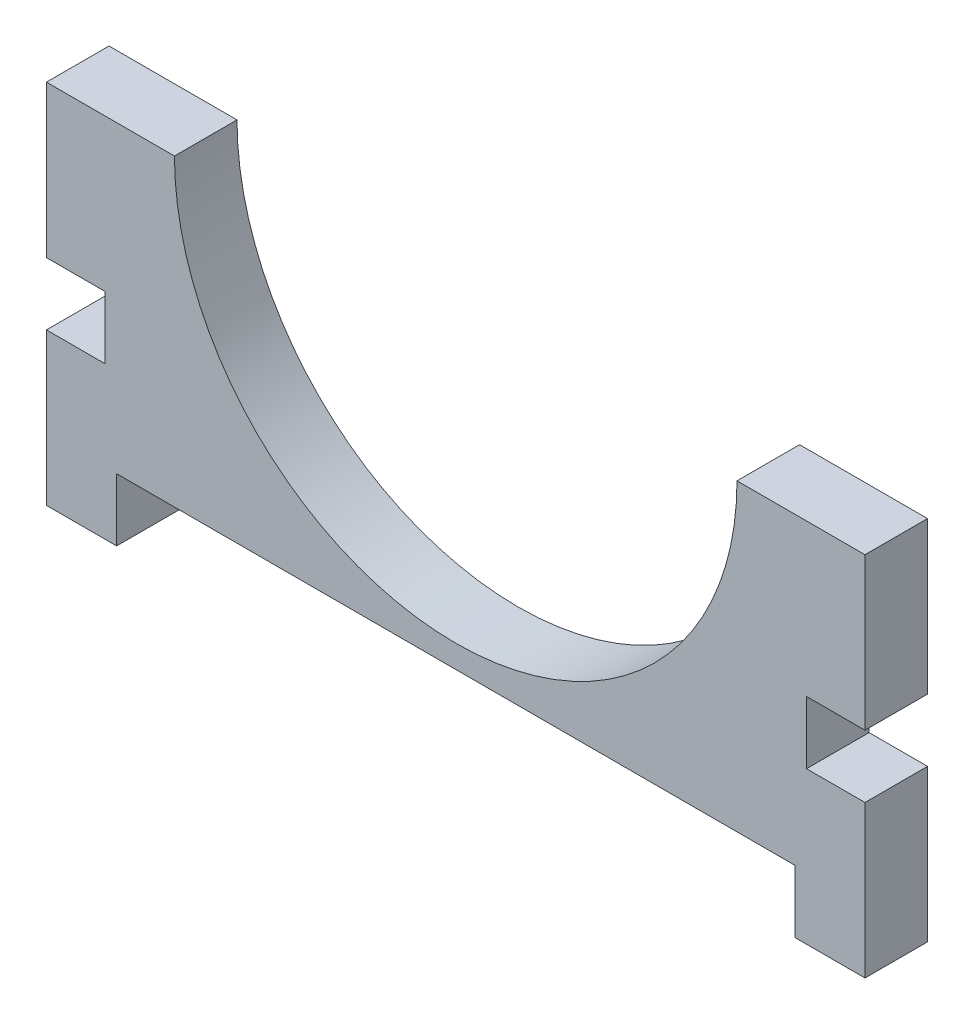
ISO-10303-21;
HEADER;
FILE_DESCRIPTION(('STEP AP214'),'2;1');
FILE_NAME('part.step','',(''),(''),'','','');
FILE_SCHEMA(('AUTOMOTIVE_DESIGN { 1 0 10303 214 1 1 1 1 }'));
ENDSEC;
DATA;
#1=APPLICATION_CONTEXT('core data for automotive mechanical design processes');
#2=APPLICATION_PROTOCOL_DEFINITION('international standard','automotive_design',2000,#1);
#3=PRODUCT_CONTEXT('',#1,'mechanical');
#4=PRODUCT('Part','Part','',(#3));
#5=PRODUCT_RELATED_PRODUCT_CATEGORY('part','',(#4));
#6=PRODUCT_DEFINITION_FORMATION('','',#4);
#7=PRODUCT_DEFINITION_CONTEXT('part definition',#1,'design');
#8=PRODUCT_DEFINITION('design','',#6,#7);
#9=PRODUCT_DEFINITION_SHAPE('','',#8);
#10=(LENGTH_UNIT() NAMED_UNIT(*) SI_UNIT(.MILLI.,.METRE.));
#11=(NAMED_UNIT(*) PLANE_ANGLE_UNIT() SI_UNIT($,.RADIAN.));
#12=(NAMED_UNIT(*) SI_UNIT($,.STERADIAN.) SOLID_ANGLE_UNIT());
#13=UNCERTAINTY_MEASURE_WITH_UNIT(LENGTH_MEASURE(1.E-05),#10,'distance_accuracy_value','');
#14=(GEOMETRIC_REPRESENTATION_CONTEXT(3) GLOBAL_UNCERTAINTY_ASSIGNED_CONTEXT((#13)) GLOBAL_UNIT_ASSIGNED_CONTEXT((#10,
#11,#12)) REPRESENTATION_CONTEXT('',''));
#15=CARTESIAN_POINT('',(0.,0.,0.));
#16=DIRECTION('',(0.,0.,1.));
#17=DIRECTION('',(1.,0.,0.));
#18=AXIS2_PLACEMENT_3D('',#15,#16,#17);
#19=CARTESIAN_POINT('',(35.,31.35,5.35));
#20=DIRECTION('',(0.,0.,-1.));
#21=DIRECTION('',(-1.,0.,0.));
#22=AXIS2_PLACEMENT_3D('',#19,#20,#21);
#23=CYLINDRICAL_SURFACE('',#22,24.055);
#24=CARTESIAN_POINT('',(35.,31.35,0.));
#25=DIRECTION('',(0.,0.,-1.));
#26=DIRECTION('',(1.,0.,0.));
#27=AXIS2_PLACEMENT_3D('',#24,#25,#26);
#28=CIRCLE('',#27,24.055);
#29=CARTESIAN_POINT('',(59.055,31.35,0.));
#30=VERTEX_POINT('',#29);
#31=CARTESIAN_POINT('',(10.945,31.35,0.));
#32=VERTEX_POINT('',#31);
#33=EDGE_CURVE('E189',#30,#32,#28,.T.);
#34=ORIENTED_EDGE('',*,*,#33,.T.);
#35=DIRECTION('',(0.,0.,-1.));
#36=VECTOR('',#35,1.);
#37=CARTESIAN_POINT('',(10.945,31.35,5.35));
#38=LINE('',#37,#36);
#39=CARTESIAN_POINT('',(10.945,31.35,5.35));
#40=VERTEX_POINT('',#39);
#41=EDGE_CURVE('E11',#40,#32,#38,.T.);
#42=ORIENTED_EDGE('',*,*,#41,.F.);
#43=CARTESIAN_POINT('',(35.,31.35,5.35));
#44=DIRECTION('',(0.,0.,-1.));
#45=DIRECTION('',(1.,0.,0.));
#46=AXIS2_PLACEMENT_3D('',#43,#44,#45);
#47=CIRCLE('',#46,24.055);
#48=CARTESIAN_POINT('',(59.055,31.35,5.35));
#49=VERTEX_POINT('',#48);
#50=EDGE_CURVE('E223',#49,#40,#47,.T.);
#51=ORIENTED_EDGE('',*,*,#50,.F.);
#52=DIRECTION('',(0.,0.,-1.));
#53=VECTOR('',#52,1.);
#54=CARTESIAN_POINT('',(59.055,31.35,5.35));
#55=LINE('',#54,#53);
#56=EDGE_CURVE('E185',#49,#30,#55,.T.);
#57=ORIENTED_EDGE('',*,*,#56,.T.);
#58=EDGE_LOOP('',(#34,#42,#51,#57));
#59=FACE_BOUND('',#58,.T.);
#60=ADVANCED_FACE('F33',(#59),#23,.F.);
#61=CARTESIAN_POINT('',(10.945,31.35,5.35));
#62=DIRECTION('',(0.,-1.,0.));
#63=DIRECTION('',(0.,0.,-1.));
#64=AXIS2_PLACEMENT_3D('',#61,#62,#63);
#65=PLANE('',#64);
#66=DIRECTION('',(-1.,0.,0.));
#67=VECTOR('',#66,1.);
#68=CARTESIAN_POINT('',(10.945,31.35,0.));
#69=LINE('',#68,#67);
#70=CARTESIAN_POINT('',(0.,31.35,0.));
#71=VERTEX_POINT('',#70);
#72=EDGE_CURVE('E192',#32,#71,#69,.T.);
#73=ORIENTED_EDGE('',*,*,#72,.T.);
#74=DIRECTION('',(0.,0.,-1.));
#75=VECTOR('',#74,1.);
#76=CARTESIAN_POINT('',(0.,31.35,5.35));
#77=LINE('',#76,#75);
#78=CARTESIAN_POINT('',(0.,31.35,5.35));
#79=VERTEX_POINT('',#78);
#80=EDGE_CURVE('E41',#79,#71,#77,.T.);
#81=ORIENTED_EDGE('',*,*,#80,.F.);
#82=DIRECTION('',(-1.,0.,0.));
#83=VECTOR('',#82,1.);
#84=CARTESIAN_POINT('',(10.945,31.35,5.35));
#85=LINE('',#84,#83);
#86=EDGE_CURVE('E122',#40,#79,#85,.T.);
#87=ORIENTED_EDGE('',*,*,#86,.F.);
#88=ORIENTED_EDGE('',*,*,#41,.T.);
#89=EDGE_LOOP('',(#73,#81,#87,#88));
#90=FACE_BOUND('',#89,.T.);
#91=ADVANCED_FACE('F331',(#90),#65,.F.);
#92=CARTESIAN_POINT('',(0.,31.35,5.35));
#93=DIRECTION('',(1.,0.,0.));
#94=DIRECTION('',(0.,0.,-1.));
#95=AXIS2_PLACEMENT_3D('',#92,#93,#94);
#96=PLANE('',#95);
#97=DIRECTION('',(0.,-1.,0.));
#98=VECTOR('',#97,1.);
#99=CARTESIAN_POINT('',(0.,31.35,0.));
#100=LINE('',#99,#98);
#101=CARTESIAN_POINT('',(0.,18.35,0.));
#102=VERTEX_POINT('',#101);
#103=EDGE_CURVE('E194',#71,#102,#100,.T.);
#104=ORIENTED_EDGE('',*,*,#103,.T.);
#105=DIRECTION('',(0.,0.,-1.));
#106=VECTOR('',#105,1.);
#107=CARTESIAN_POINT('',(0.,18.35,5.35));
#108=LINE('',#107,#106);
#109=CARTESIAN_POINT('',(0.,18.35,5.35));
#110=VERTEX_POINT('',#109);
#111=EDGE_CURVE('E260',#110,#102,#108,.T.);
#112=ORIENTED_EDGE('',*,*,#111,.F.);
#113=DIRECTION('',(0.,-1.,0.));
#114=VECTOR('',#113,1.);
#115=CARTESIAN_POINT('',(0.,31.35,5.35));
#116=LINE('',#115,#114);
#117=EDGE_CURVE('E268',#79,#110,#116,.T.);
#118=ORIENTED_EDGE('',*,*,#117,.F.);
#119=ORIENTED_EDGE('',*,*,#80,.T.);
#120=EDGE_LOOP('',(#104,#112,#118,#119));
#121=FACE_BOUND('',#120,.T.);
#122=ADVANCED_FACE('F266',(#121),#96,.F.);
#123=CARTESIAN_POINT('',(0.,18.35,5.35));
#124=DIRECTION('',(0.,1.,0.));
#125=DIRECTION('',(0.,0.,1.));
#126=AXIS2_PLACEMENT_3D('',#123,#124,#125);
#127=PLANE('',#126);
#128=DIRECTION('',(1.,0.,0.));
#129=VECTOR('',#128,1.);
#130=CARTESIAN_POINT('',(0.,18.35,0.));
#131=LINE('',#130,#129);
#132=CARTESIAN_POINT('',(5.,18.35,0.));
#133=VERTEX_POINT('',#132);
#134=EDGE_CURVE('E196',#102,#133,#131,.T.);
#135=ORIENTED_EDGE('',*,*,#134,.T.);
#136=DIRECTION('',(0.,0.,-1.));
#137=VECTOR('',#136,1.);
#138=CARTESIAN_POINT('',(5.,18.35,5.35));
#139=LINE('',#138,#137);
#140=CARTESIAN_POINT('',(5.,18.35,5.35));
#141=VERTEX_POINT('',#140);
#142=EDGE_CURVE('E257',#141,#133,#139,.T.);
#143=ORIENTED_EDGE('',*,*,#142,.F.);
#144=DIRECTION('',(1.,0.,0.));
#145=VECTOR('',#144,1.);
#146=CARTESIAN_POINT('',(0.,18.35,5.35));
#147=LINE('',#146,#145);
#148=EDGE_CURVE('E286',#110,#141,#147,.T.);
#149=ORIENTED_EDGE('',*,*,#148,.F.);
#150=ORIENTED_EDGE('',*,*,#111,.T.);
#151=EDGE_LOOP('',(#135,#143,#149,#150));
#152=FACE_BOUND('',#151,.T.);
#153=ADVANCED_FACE('F277',(#152),#127,.F.);
#154=CARTESIAN_POINT('',(5.,18.35,5.35));
#155=DIRECTION('',(1.,0.,0.));
#156=DIRECTION('',(0.,0.,-1.));
#157=AXIS2_PLACEMENT_3D('',#154,#155,#156);
#158=PLANE('',#157);
#159=DIRECTION('',(0.,-1.,0.));
#160=VECTOR('',#159,1.);
#161=CARTESIAN_POINT('',(5.,18.35,0.));
#162=LINE('',#161,#160);
#163=CARTESIAN_POINT('',(5.,13.,0.));
#164=VERTEX_POINT('',#163);
#165=EDGE_CURVE('E198',#133,#164,#162,.T.);
#166=ORIENTED_EDGE('',*,*,#165,.T.);
#167=DIRECTION('',(0.,0.,-1.));
#168=VECTOR('',#167,1.);
#169=CARTESIAN_POINT('',(5.,13.,5.35));
#170=LINE('',#169,#168);
#171=CARTESIAN_POINT('',(5.,13.,5.35));
#172=VERTEX_POINT('',#171);
#173=EDGE_CURVE('E254',#172,#164,#170,.T.);
#174=ORIENTED_EDGE('',*,*,#173,.F.);
#175=DIRECTION('',(0.,-1.,0.));
#176=VECTOR('',#175,1.);
#177=CARTESIAN_POINT('',(5.,18.35,5.35));
#178=LINE('',#177,#176);
#179=EDGE_CURVE('E283',#141,#172,#178,.T.);
#180=ORIENTED_EDGE('',*,*,#179,.F.);
#181=ORIENTED_EDGE('',*,*,#142,.T.);
#182=EDGE_LOOP('',(#166,#174,#180,#181));
#183=FACE_BOUND('',#182,.T.);
#184=ADVANCED_FACE('F281',(#183),#158,.F.);
#185=CARTESIAN_POINT('',(5.,13.,5.35));
#186=DIRECTION('',(0.,-1.,0.));
#187=DIRECTION('',(0.,0.,-1.));
#188=AXIS2_PLACEMENT_3D('',#185,#186,#187);
#189=PLANE('',#188);
#190=DIRECTION('',(-1.,0.,0.));
#191=VECTOR('',#190,1.);
#192=CARTESIAN_POINT('',(5.,13.,0.));
#193=LINE('',#192,#191);
#194=CARTESIAN_POINT('',(0.,13.,0.));
#195=VERTEX_POINT('',#194);
#196=EDGE_CURVE('E200',#164,#195,#193,.T.);
#197=ORIENTED_EDGE('',*,*,#196,.T.);
#198=DIRECTION('',(0.,0.,-1.));
#199=VECTOR('',#198,1.);
#200=CARTESIAN_POINT('',(0.,13.,5.35));
#201=LINE('',#200,#199);
#202=CARTESIAN_POINT('',(0.,13.,5.35));
#203=VERTEX_POINT('',#202);
#204=EDGE_CURVE('E251',#203,#195,#201,.T.);
#205=ORIENTED_EDGE('',*,*,#204,.F.);
#206=DIRECTION('',(-1.,0.,0.));
#207=VECTOR('',#206,1.);
#208=CARTESIAN_POINT('',(5.,13.,5.35));
#209=LINE('',#208,#207);
#210=EDGE_CURVE('E285',#172,#203,#209,.T.);
#211=ORIENTED_EDGE('',*,*,#210,.F.);
#212=ORIENTED_EDGE('',*,*,#173,.T.);
#213=EDGE_LOOP('',(#197,#205,#211,#212));
#214=FACE_BOUND('',#213,.T.);
#215=ADVANCED_FACE('F344',(#214),#189,.F.);
#216=CARTESIAN_POINT('',(0.,13.,5.35));
#217=DIRECTION('',(1.,0.,0.));
#218=DIRECTION('',(0.,0.,-1.));
#219=AXIS2_PLACEMENT_3D('',#216,#217,#218);
#220=PLANE('',#219);
#221=DIRECTION('',(0.,-1.,0.));
#222=VECTOR('',#221,1.);
#223=CARTESIAN_POINT('',(0.,13.,0.));
#224=LINE('',#223,#222);
#225=CARTESIAN_POINT('',(0.,0.,0.));
#226=VERTEX_POINT('',#225);
#227=EDGE_CURVE('E202',#195,#226,#224,.T.);
#228=ORIENTED_EDGE('',*,*,#227,.T.);
#229=DIRECTION('',(0.,0.,-1.));
#230=VECTOR('',#229,1.);
#231=CARTESIAN_POINT('',(0.,0.,5.35));
#232=LINE('',#231,#230);
#233=CARTESIAN_POINT('',(0.,0.,5.35));
#234=VERTEX_POINT('',#233);
#235=EDGE_CURVE('E248',#234,#226,#232,.T.);
#236=ORIENTED_EDGE('',*,*,#235,.F.);
#237=DIRECTION('',(0.,-1.,0.));
#238=VECTOR('',#237,1.);
#239=CARTESIAN_POINT('',(0.,13.,5.35));
#240=LINE('',#239,#238);
#241=EDGE_CURVE('E288',#203,#234,#240,.T.);
#242=ORIENTED_EDGE('',*,*,#241,.F.);
#243=ORIENTED_EDGE('',*,*,#204,.T.);
#244=EDGE_LOOP('',(#228,#236,#242,#243));
#245=FACE_BOUND('',#244,.T.);
#246=ADVANCED_FACE('F347',(#245),#220,.F.);
#247=CARTESIAN_POINT('',(0.,0.,5.35));
#248=DIRECTION('',(0.,1.,0.));
#249=DIRECTION('',(0.,0.,1.));
#250=AXIS2_PLACEMENT_3D('',#247,#248,#249);
#251=PLANE('',#250);
#252=DIRECTION('',(1.,0.,0.));
#253=VECTOR('',#252,1.);
#254=CARTESIAN_POINT('',(0.,0.,0.));
#255=LINE('',#254,#253);
#256=CARTESIAN_POINT('',(6.,0.,0.));
#257=VERTEX_POINT('',#256);
#258=EDGE_CURVE('E204',#226,#257,#255,.T.);
#259=ORIENTED_EDGE('',*,*,#258,.T.);
#260=DIRECTION('',(0.,0.,-1.));
#261=VECTOR('',#260,1.);
#262=CARTESIAN_POINT('',(6.,0.,5.35));
#263=LINE('',#262,#261);
#264=CARTESIAN_POINT('',(6.,0.,5.35));
#265=VERTEX_POINT('',#264);
#266=EDGE_CURVE('E245',#265,#257,#263,.T.);
#267=ORIENTED_EDGE('',*,*,#266,.F.);
#268=DIRECTION('',(1.,0.,0.));
#269=VECTOR('',#268,1.);
#270=CARTESIAN_POINT('',(0.,0.,5.35));
#271=LINE('',#270,#269);
#272=EDGE_CURVE('E294',#234,#265,#271,.T.);
#273=ORIENTED_EDGE('',*,*,#272,.F.);
#274=ORIENTED_EDGE('',*,*,#235,.T.);
#275=EDGE_LOOP('',(#259,#267,#273,#274));
#276=FACE_BOUND('',#275,.T.);
#277=ADVANCED_FACE('F351',(#276),#251,.F.);
#278=CARTESIAN_POINT('',(6.,0.,5.35));
#279=DIRECTION('',(-1.,0.,0.));
#280=DIRECTION('',(0.,0.,1.));
#281=AXIS2_PLACEMENT_3D('',#278,#279,#280);
#282=PLANE('',#281);
#283=DIRECTION('',(0.,1.,0.));
#284=VECTOR('',#283,1.);
#285=CARTESIAN_POINT('',(6.,0.,0.));
#286=LINE('',#285,#284);
#287=CARTESIAN_POINT('',(6.,5.34999999999999,0.));
#288=VERTEX_POINT('',#287);
#289=EDGE_CURVE('E206',#257,#288,#286,.T.);
#290=ORIENTED_EDGE('',*,*,#289,.T.);
#291=DIRECTION('',(0.,0.,-1.));
#292=VECTOR('',#291,1.);
#293=CARTESIAN_POINT('',(6.,5.34999999999999,5.35));
#294=LINE('',#293,#292);
#295=CARTESIAN_POINT('',(6.,5.34999999999999,5.35));
#296=VERTEX_POINT('',#295);
#297=EDGE_CURVE('E242',#296,#288,#294,.T.);
#298=ORIENTED_EDGE('',*,*,#297,.F.);
#299=DIRECTION('',(0.,1.,0.));
#300=VECTOR('',#299,1.);
#301=CARTESIAN_POINT('',(6.,0.,5.35));
#302=LINE('',#301,#300);
#303=EDGE_CURVE('E296',#265,#296,#302,.T.);
#304=ORIENTED_EDGE('',*,*,#303,.F.);
#305=ORIENTED_EDGE('',*,*,#266,.T.);
#306=EDGE_LOOP('',(#290,#298,#304,#305));
#307=FACE_BOUND('',#306,.T.);
#308=ADVANCED_FACE('F355',(#307),#282,.F.);
#309=CARTESIAN_POINT('',(6.,5.34999999999999,5.35));
#310=DIRECTION('',(0.,1.,0.));
#311=DIRECTION('',(0.,0.,1.));
#312=AXIS2_PLACEMENT_3D('',#309,#310,#311);
#313=PLANE('',#312);
#314=DIRECTION('',(1.,0.,0.));
#315=VECTOR('',#314,1.);
#316=CARTESIAN_POINT('',(6.,5.34999999999999,0.));
#317=LINE('',#316,#315);
#318=CARTESIAN_POINT('',(64.,5.34999999999999,0.));
#319=VERTEX_POINT('',#318);
#320=EDGE_CURVE('E208',#288,#319,#317,.T.);
#321=ORIENTED_EDGE('',*,*,#320,.T.);
#322=DIRECTION('',(0.,0.,-1.));
#323=VECTOR('',#322,1.);
#324=CARTESIAN_POINT('',(64.,5.34999999999999,5.35));
#325=LINE('',#324,#323);
#326=CARTESIAN_POINT('',(64.,5.34999999999999,5.35));
#327=VERTEX_POINT('',#326);
#328=EDGE_CURVE('E239',#327,#319,#325,.T.);
#329=ORIENTED_EDGE('',*,*,#328,.F.);
#330=DIRECTION('',(1.,0.,0.));
#331=VECTOR('',#330,1.);
#332=CARTESIAN_POINT('',(6.,5.34999999999999,5.35));
#333=LINE('',#332,#331);
#334=EDGE_CURVE('E298',#296,#327,#333,.T.);
#335=ORIENTED_EDGE('',*,*,#334,.F.);
#336=ORIENTED_EDGE('',*,*,#297,.T.);
#337=EDGE_LOOP('',(#321,#329,#335,#336));
#338=FACE_BOUND('',#337,.T.);
#339=ADVANCED_FACE('F359',(#338),#313,.F.);
#340=CARTESIAN_POINT('',(64.,0.,5.35));
#341=DIRECTION('',(1.,0.,0.));
#342=DIRECTION('',(0.,0.,-1.));
#343=AXIS2_PLACEMENT_3D('',#340,#341,#342);
#344=PLANE('',#343);
#345=DIRECTION('',(0.,-1.,0.));
#346=VECTOR('',#345,1.);
#347=CARTESIAN_POINT('',(64.,0.,0.));
#348=LINE('',#347,#346);
#349=CARTESIAN_POINT('',(64.,0.,0.));
#350=VERTEX_POINT('',#349);
#351=EDGE_CURVE('E210',#319,#350,#348,.T.);
#352=ORIENTED_EDGE('',*,*,#351,.T.);
#353=DIRECTION('',(0.,0.,-1.));
#354=VECTOR('',#353,1.);
#355=CARTESIAN_POINT('',(64.,0.,5.35));
#356=LINE('',#355,#354);
#357=CARTESIAN_POINT('',(64.,0.,5.35));
#358=VERTEX_POINT('',#357);
#359=EDGE_CURVE('E236',#358,#350,#356,.T.);
#360=ORIENTED_EDGE('',*,*,#359,.F.);
#361=DIRECTION('',(0.,-1.,0.));
#362=VECTOR('',#361,1.);
#363=CARTESIAN_POINT('',(64.,0.,5.35));
#364=LINE('',#363,#362);
#365=EDGE_CURVE('E300',#327,#358,#364,.T.);
#366=ORIENTED_EDGE('',*,*,#365,.F.);
#367=ORIENTED_EDGE('',*,*,#328,.T.);
#368=EDGE_LOOP('',(#352,#360,#366,#367));
#369=FACE_BOUND('',#368,.T.);
#370=ADVANCED_FACE('F363',(#369),#344,.F.);
#371=CARTESIAN_POINT('',(70.,0.,5.35));
#372=DIRECTION('',(0.,1.,0.));
#373=DIRECTION('',(0.,0.,1.));
#374=AXIS2_PLACEMENT_3D('',#371,#372,#373);
#375=PLANE('',#374);
#376=DIRECTION('',(1.,0.,0.));
#377=VECTOR('',#376,1.);
#378=CARTESIAN_POINT('',(70.,0.,0.));
#379=LINE('',#378,#377);
#380=CARTESIAN_POINT('',(70.,0.,0.));
#381=VERTEX_POINT('',#380);
#382=EDGE_CURVE('E212',#350,#381,#379,.T.);
#383=ORIENTED_EDGE('',*,*,#382,.T.);
#384=DIRECTION('',(0.,0.,-1.));
#385=VECTOR('',#384,1.);
#386=CARTESIAN_POINT('',(70.,0.,5.35));
#387=LINE('',#386,#385);
#388=CARTESIAN_POINT('',(70.,0.,5.35));
#389=VERTEX_POINT('',#388);
#390=EDGE_CURVE('E233',#389,#381,#387,.T.);
#391=ORIENTED_EDGE('',*,*,#390,.F.);
#392=DIRECTION('',(1.,0.,0.));
#393=VECTOR('',#392,1.);
#394=CARTESIAN_POINT('',(70.,0.,5.35));
#395=LINE('',#394,#393);
#396=EDGE_CURVE('E302',#358,#389,#395,.T.);
#397=ORIENTED_EDGE('',*,*,#396,.F.);
#398=ORIENTED_EDGE('',*,*,#359,.T.);
#399=EDGE_LOOP('',(#383,#391,#397,#398));
#400=FACE_BOUND('',#399,.T.);
#401=ADVANCED_FACE('F367',(#400),#375,.F.);
#402=CARTESIAN_POINT('',(70.,13.,5.35));
#403=DIRECTION('',(-1.,0.,0.));
#404=DIRECTION('',(0.,0.,1.));
#405=AXIS2_PLACEMENT_3D('',#402,#403,#404);
#406=PLANE('',#405);
#407=DIRECTION('',(0.,1.,0.));
#408=VECTOR('',#407,1.);
#409=CARTESIAN_POINT('',(70.,13.,0.));
#410=LINE('',#409,#408);
#411=CARTESIAN_POINT('',(70.,13.,0.));
#412=VERTEX_POINT('',#411);
#413=EDGE_CURVE('E214',#381,#412,#410,.T.);
#414=ORIENTED_EDGE('',*,*,#413,.T.);
#415=DIRECTION('',(0.,0.,-1.));
#416=VECTOR('',#415,1.);
#417=CARTESIAN_POINT('',(70.,13.,5.35));
#418=LINE('',#417,#416);
#419=CARTESIAN_POINT('',(70.,13.,5.35));
#420=VERTEX_POINT('',#419);
#421=EDGE_CURVE('E230',#420,#412,#418,.T.);
#422=ORIENTED_EDGE('',*,*,#421,.F.);
#423=DIRECTION('',(0.,1.,0.));
#424=VECTOR('',#423,1.);
#425=CARTESIAN_POINT('',(70.,13.,5.35));
#426=LINE('',#425,#424);
#427=EDGE_CURVE('E304',#389,#420,#426,.T.);
#428=ORIENTED_EDGE('',*,*,#427,.F.);
#429=ORIENTED_EDGE('',*,*,#390,.T.);
#430=EDGE_LOOP('',(#414,#422,#428,#429));
#431=FACE_BOUND('',#430,.T.);
#432=ADVANCED_FACE('F371',(#431),#406,.F.);
#433=CARTESIAN_POINT('',(65.,13.,5.35));
#434=DIRECTION('',(0.,-1.,0.));
#435=DIRECTION('',(0.,0.,-1.));
#436=AXIS2_PLACEMENT_3D('',#433,#434,#435);
#437=PLANE('',#436);
#438=DIRECTION('',(-1.,0.,0.));
#439=VECTOR('',#438,1.);
#440=CARTESIAN_POINT('',(65.,13.,0.));
#441=LINE('',#440,#439);
#442=CARTESIAN_POINT('',(65.,13.,0.));
#443=VERTEX_POINT('',#442);
#444=EDGE_CURVE('E216',#412,#443,#441,.T.);
#445=ORIENTED_EDGE('',*,*,#444,.T.);
#446=DIRECTION('',(0.,0.,-1.));
#447=VECTOR('',#446,1.);
#448=CARTESIAN_POINT('',(65.,13.,5.35));
#449=LINE('',#448,#447);
#450=CARTESIAN_POINT('',(65.,13.,5.35));
#451=VERTEX_POINT('',#450);
#452=EDGE_CURVE('E227',#451,#443,#449,.T.);
#453=ORIENTED_EDGE('',*,*,#452,.F.);
#454=DIRECTION('',(-1.,0.,0.));
#455=VECTOR('',#454,1.);
#456=CARTESIAN_POINT('',(65.,13.,5.35));
#457=LINE('',#456,#455);
#458=EDGE_CURVE('E306',#420,#451,#457,.T.);
#459=ORIENTED_EDGE('',*,*,#458,.F.);
#460=ORIENTED_EDGE('',*,*,#421,.T.);
#461=EDGE_LOOP('',(#445,#453,#459,#460));
#462=FACE_BOUND('',#461,.T.);
#463=ADVANCED_FACE('F312',(#462),#437,.F.);
#464=CARTESIAN_POINT('',(65.,18.35,5.35));
#465=DIRECTION('',(-1.,0.,0.));
#466=DIRECTION('',(0.,0.,1.));
#467=AXIS2_PLACEMENT_3D('',#464,#465,#466);
#468=PLANE('',#467);
#469=DIRECTION('',(0.,1.,0.));
#470=VECTOR('',#469,1.);
#471=CARTESIAN_POINT('',(65.,18.35,0.));
#472=LINE('',#471,#470);
#473=CARTESIAN_POINT('',(65.,18.35,0.));
#474=VERTEX_POINT('',#473);
#475=EDGE_CURVE('E218',#443,#474,#472,.T.);
#476=ORIENTED_EDGE('',*,*,#475,.T.);
#477=DIRECTION('',(0.,0.,-1.));
#478=VECTOR('',#477,1.);
#479=CARTESIAN_POINT('',(65.,18.35,5.35));
#480=LINE('',#479,#478);
#481=CARTESIAN_POINT('',(65.,18.35,5.35));
#482=VERTEX_POINT('',#481);
#483=EDGE_CURVE('E180',#482,#474,#480,.T.);
#484=ORIENTED_EDGE('',*,*,#483,.F.);
#485=DIRECTION('',(0.,1.,0.));
#486=VECTOR('',#485,1.);
#487=CARTESIAN_POINT('',(65.,18.35,5.35));
#488=LINE('',#487,#486);
#489=EDGE_CURVE('E171',#451,#482,#488,.T.);
#490=ORIENTED_EDGE('',*,*,#489,.F.);
#491=ORIENTED_EDGE('',*,*,#452,.T.);
#492=EDGE_LOOP('',(#476,#484,#490,#491));
#493=FACE_BOUND('',#492,.T.);
#494=ADVANCED_FACE('F316',(#493),#468,.F.);
#495=CARTESIAN_POINT('',(70.,18.35,5.35));
#496=DIRECTION('',(0.,1.,0.));
#497=DIRECTION('',(0.,0.,1.));
#498=AXIS2_PLACEMENT_3D('',#495,#496,#497);
#499=PLANE('',#498);
#500=DIRECTION('',(1.,0.,0.));
#501=VECTOR('',#500,1.);
#502=CARTESIAN_POINT('',(70.,18.35,0.));
#503=LINE('',#502,#501);
#504=CARTESIAN_POINT('',(70.,18.35,0.));
#505=VERTEX_POINT('',#504);
#506=EDGE_CURVE('E179',#474,#505,#503,.T.);
#507=ORIENTED_EDGE('',*,*,#506,.T.);
#508=DIRECTION('',(0.,0.,-1.));
#509=VECTOR('',#508,1.);
#510=CARTESIAN_POINT('',(70.,18.35,5.35));
#511=LINE('',#510,#509);
#512=CARTESIAN_POINT('',(70.,18.35,5.35));
#513=VERTEX_POINT('',#512);
#514=EDGE_CURVE('E176',#513,#505,#511,.T.);
#515=ORIENTED_EDGE('',*,*,#514,.F.);
#516=DIRECTION('',(1.,0.,0.));
#517=VECTOR('',#516,1.);
#518=CARTESIAN_POINT('',(70.,18.35,5.35));
#519=LINE('',#518,#517);
#520=EDGE_CURVE('E165',#482,#513,#519,.T.);
#521=ORIENTED_EDGE('',*,*,#520,.F.);
#522=ORIENTED_EDGE('',*,*,#483,.T.);
#523=EDGE_LOOP('',(#507,#515,#521,#522));
#524=FACE_BOUND('',#523,.T.);
#525=ADVANCED_FACE('F177',(#524),#499,.F.);
#526=CARTESIAN_POINT('',(70.,31.35,5.35));
#527=DIRECTION('',(-1.,0.,0.));
#528=DIRECTION('',(0.,0.,1.));
#529=AXIS2_PLACEMENT_3D('',#526,#527,#528);
#530=PLANE('',#529);
#531=DIRECTION('',(0.,1.,0.));
#532=VECTOR('',#531,1.);
#533=CARTESIAN_POINT('',(70.,31.35,0.));
#534=LINE('',#533,#532);
#535=CARTESIAN_POINT('',(70.,31.35,0.));
#536=VERTEX_POINT('',#535);
#537=EDGE_CURVE('E108',#505,#536,#534,.T.);
#538=ORIENTED_EDGE('',*,*,#537,.T.);
#539=DIRECTION('',(0.,0.,-1.));
#540=VECTOR('',#539,1.);
#541=CARTESIAN_POINT('',(70.,31.35,5.35));
#542=LINE('',#541,#540);
#543=CARTESIAN_POINT('',(70.,31.35,5.35));
#544=VERTEX_POINT('',#543);
#545=EDGE_CURVE('E181',#544,#536,#542,.T.);
#546=ORIENTED_EDGE('',*,*,#545,.F.);
#547=DIRECTION('',(0.,1.,0.));
#548=VECTOR('',#547,1.);
#549=CARTESIAN_POINT('',(70.,31.35,5.35));
#550=LINE('',#549,#548);
#551=EDGE_CURVE('E169',#513,#544,#550,.T.);
#552=ORIENTED_EDGE('',*,*,#551,.F.);
#553=ORIENTED_EDGE('',*,*,#514,.T.);
#554=EDGE_LOOP('',(#538,#546,#552,#553));
#555=FACE_BOUND('',#554,.T.);
#556=ADVANCED_FACE('F183',(#555),#530,.F.);
#557=CARTESIAN_POINT('',(59.055,31.35,5.35));
#558=DIRECTION('',(0.,-1.,0.));
#559=DIRECTION('',(0.,0.,-1.));
#560=AXIS2_PLACEMENT_3D('',#557,#558,#559);
#561=PLANE('',#560);
#562=DIRECTION('',(-1.,0.,0.));
#563=VECTOR('',#562,1.);
#564=CARTESIAN_POINT('',(59.055,31.35,0.));
#565=LINE('',#564,#563);
#566=EDGE_CURVE('E114',#536,#30,#565,.T.);
#567=ORIENTED_EDGE('',*,*,#566,.T.);
#568=ORIENTED_EDGE('',*,*,#56,.F.);
#569=DIRECTION('',(-1.,0.,0.));
#570=VECTOR('',#569,1.);
#571=CARTESIAN_POINT('',(59.055,31.35,5.35));
#572=LINE('',#571,#570);
#573=EDGE_CURVE('E49',#544,#49,#572,.T.);
#574=ORIENTED_EDGE('',*,*,#573,.F.);
#575=ORIENTED_EDGE('',*,*,#545,.T.);
#576=EDGE_LOOP('',(#567,#568,#574,#575));
#577=FACE_BOUND('',#576,.T.);
#578=ADVANCED_FACE('F320',(#577),#561,.F.);
#579=CARTESIAN_POINT('',(35.,31.35,5.35));
#580=DIRECTION('',(0.,0.,1.));
#581=DIRECTION('',(1.,0.,0.));
#582=AXIS2_PLACEMENT_3D('',#579,#580,#581);
#583=PLANE('',#582);
#584=ORIENTED_EDGE('',*,*,#50,.T.);
#585=ORIENTED_EDGE('',*,*,#86,.T.);
#586=ORIENTED_EDGE('',*,*,#117,.T.);
#587=ORIENTED_EDGE('',*,*,#148,.T.);
#588=ORIENTED_EDGE('',*,*,#179,.T.);
#589=ORIENTED_EDGE('',*,*,#210,.T.);
#590=ORIENTED_EDGE('',*,*,#241,.T.);
#591=ORIENTED_EDGE('',*,*,#272,.T.);
#592=ORIENTED_EDGE('',*,*,#303,.T.);
#593=ORIENTED_EDGE('',*,*,#334,.T.);
#594=ORIENTED_EDGE('',*,*,#365,.T.);
#595=ORIENTED_EDGE('',*,*,#396,.T.);
#596=ORIENTED_EDGE('',*,*,#427,.T.);
#597=ORIENTED_EDGE('',*,*,#458,.T.);
#598=ORIENTED_EDGE('',*,*,#489,.T.);
#599=ORIENTED_EDGE('',*,*,#520,.T.);
#600=ORIENTED_EDGE('',*,*,#551,.T.);
#601=ORIENTED_EDGE('',*,*,#573,.T.);
#602=EDGE_LOOP('',(#584,#585,#586,#587,#588,#589,#590,#591,#592,#593,#594,#595,#596,#597,#598,
#599,#600,#601));
#603=FACE_BOUND('',#602,.T.);
#604=ADVANCED_FACE('F167',(#603),#583,.T.);
#605=CARTESIAN_POINT('',(35.,31.35,0.));
#606=DIRECTION('',(0.,0.,1.));
#607=DIRECTION('',(1.,0.,0.));
#608=AXIS2_PLACEMENT_3D('',#605,#606,#607);
#609=PLANE('',#608);
#610=ORIENTED_EDGE('',*,*,#33,.F.);
#611=ORIENTED_EDGE('',*,*,#566,.F.);
#612=ORIENTED_EDGE('',*,*,#537,.F.);
#613=ORIENTED_EDGE('',*,*,#506,.F.);
#614=ORIENTED_EDGE('',*,*,#475,.F.);
#615=ORIENTED_EDGE('',*,*,#444,.F.);
#616=ORIENTED_EDGE('',*,*,#413,.F.);
#617=ORIENTED_EDGE('',*,*,#382,.F.);
#618=ORIENTED_EDGE('',*,*,#351,.F.);
#619=ORIENTED_EDGE('',*,*,#320,.F.);
#620=ORIENTED_EDGE('',*,*,#289,.F.);
#621=ORIENTED_EDGE('',*,*,#258,.F.);
#622=ORIENTED_EDGE('',*,*,#227,.F.);
#623=ORIENTED_EDGE('',*,*,#196,.F.);
#624=ORIENTED_EDGE('',*,*,#165,.F.);
#625=ORIENTED_EDGE('',*,*,#134,.F.);
#626=ORIENTED_EDGE('',*,*,#103,.F.);
#627=ORIENTED_EDGE('',*,*,#72,.F.);
#628=EDGE_LOOP('',(#610,#611,#612,#613,#614,#615,#616,#617,#618,#619,#620,#621,#622,#623,#624,
#625,#626,#627));
#629=FACE_BOUND('',#628,.T.);
#630=ADVANCED_FACE('F272',(#629),#609,.F.);
#631=CLOSED_SHELL('',(#60,#91,#122,#153,#184,#215,#246,#277,#308,#339,#370,#401,#432,#463,#494,
#525,#556,#578,#604,#630));
#632=MANIFOLD_SOLID_BREP('B2',#631);
#633=ADVANCED_BREP_SHAPE_REPRESENTATION('',(#18,#632),#14);
#634=SHAPE_DEFINITION_REPRESENTATION(#9,#633);
ENDSEC;
END-ISO-10303-21;
